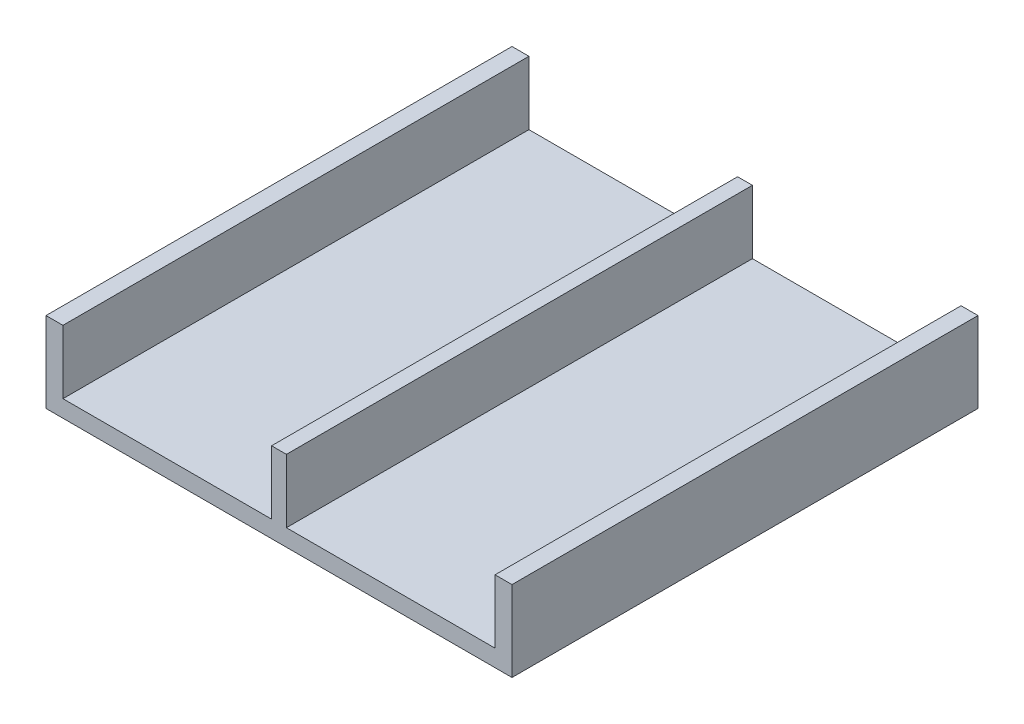
ISO-10303-21;
HEADER;
FILE_DESCRIPTION(('STEP AP214'),'2;1');
FILE_NAME('part.step','',(''),(''),'','','');
FILE_SCHEMA(('AUTOMOTIVE_DESIGN { 1 0 10303 214 1 1 1 1 }'));
ENDSEC;
DATA;
#1=APPLICATION_CONTEXT('core data for automotive mechanical design processes');
#2=APPLICATION_PROTOCOL_DEFINITION('international standard','automotive_design',2000,#1);
#3=PRODUCT_CONTEXT('',#1,'mechanical');
#4=PRODUCT('Part','Part','',(#3));
#5=PRODUCT_RELATED_PRODUCT_CATEGORY('part','',(#4));
#6=PRODUCT_DEFINITION_FORMATION('','',#4);
#7=PRODUCT_DEFINITION_CONTEXT('part definition',#1,'design');
#8=PRODUCT_DEFINITION('design','',#6,#7);
#9=PRODUCT_DEFINITION_SHAPE('','',#8);
#10=(LENGTH_UNIT() NAMED_UNIT(*) SI_UNIT(.MILLI.,.METRE.));
#11=(NAMED_UNIT(*) PLANE_ANGLE_UNIT() SI_UNIT($,.RADIAN.));
#12=(NAMED_UNIT(*) SI_UNIT($,.STERADIAN.) SOLID_ANGLE_UNIT());
#13=UNCERTAINTY_MEASURE_WITH_UNIT(LENGTH_MEASURE(1.E-05),#10,'distance_accuracy_value','');
#14=(GEOMETRIC_REPRESENTATION_CONTEXT(3) GLOBAL_UNCERTAINTY_ASSIGNED_CONTEXT((#13)) GLOBAL_UNIT_ASSIGNED_CONTEXT((#10,
#11,#12)) REPRESENTATION_CONTEXT('',''));
#15=CARTESIAN_POINT('',(0.,0.,0.));
#16=DIRECTION('',(0.,0.,1.));
#17=DIRECTION('',(1.,0.,0.));
#18=AXIS2_PLACEMENT_3D('',#15,#16,#17);
#19=CARTESIAN_POINT('',(0.,19.,0.));
#20=DIRECTION('',(0.,1.,0.));
#21=DIRECTION('',(0.,0.,1.));
#22=AXIS2_PLACEMENT_3D('',#19,#20,#21);
#23=PLANE('',#22);
#24=DIRECTION('',(0.,0.,-1.));
#25=VECTOR('',#24,1.);
#26=CARTESIAN_POINT('',(-1.75,19.,-55.));
#27=LINE('',#26,#25);
#28=CARTESIAN_POINT('',(-1.74999999999999,19.,55.));
#29=VERTEX_POINT('',#28);
#30=CARTESIAN_POINT('',(-1.75,19.,-55.));
#31=VERTEX_POINT('',#30);
#32=EDGE_CURVE('E127',#29,#31,#27,.T.);
#33=ORIENTED_EDGE('',*,*,#32,.F.);
#34=DIRECTION('',(1.,0.,0.));
#35=VECTOR('',#34,1.);
#36=CARTESIAN_POINT('',(-55.,19.,55.));
#37=LINE('',#36,#35);
#38=CARTESIAN_POINT('',(1.75000000000001,19.,55.));
#39=VERTEX_POINT('',#38);
#40=EDGE_CURVE('E200',#29,#39,#37,.T.);
#41=ORIENTED_EDGE('',*,*,#40,.T.);
#42=DIRECTION('',(0.,0.,1.));
#43=VECTOR('',#42,1.);
#44=CARTESIAN_POINT('',(1.75,19.,-55.));
#45=LINE('',#44,#43);
#46=CARTESIAN_POINT('',(1.75,19.,-55.));
#47=VERTEX_POINT('',#46);
#48=EDGE_CURVE('E174',#47,#39,#45,.T.);
#49=ORIENTED_EDGE('',*,*,#48,.F.);
#50=DIRECTION('',(-1.,0.,0.));
#51=VECTOR('',#50,1.);
#52=CARTESIAN_POINT('',(-55.,19.,-55.));
#53=LINE('',#52,#51);
#54=EDGE_CURVE('E193',#47,#31,#53,.T.);
#55=ORIENTED_EDGE('',*,*,#54,.T.);
#56=EDGE_LOOP('',(#33,#41,#49,#55));
#57=FACE_BOUND('',#56,.T.);
#58=ADVANCED_FACE('F33',(#57),#23,.T.);
#59=DIRECTION('',(0.,0.,1.));
#60=VECTOR('',#59,1.);
#61=CARTESIAN_POINT('',(-51.,19.,-55.));
#62=LINE('',#61,#60);
#63=CARTESIAN_POINT('',(-51.,19.,-55.));
#64=VERTEX_POINT('',#63);
#65=CARTESIAN_POINT('',(-51.,19.,55.));
#66=VERTEX_POINT('',#65);
#67=EDGE_CURVE('E141',#64,#66,#62,.T.);
#68=ORIENTED_EDGE('',*,*,#67,.F.);
#69=CARTESIAN_POINT('',(-55.,19.,-55.));
#70=VERTEX_POINT('',#69);
#71=EDGE_CURVE('E187',#64,#70,#53,.T.);
#72=ORIENTED_EDGE('',*,*,#71,.T.);
#73=DIRECTION('',(0.,0.,1.));
#74=VECTOR('',#73,1.);
#75=CARTESIAN_POINT('',(-55.,19.,-55.));
#76=LINE('',#75,#74);
#77=CARTESIAN_POINT('',(-55.,19.,55.));
#78=VERTEX_POINT('',#77);
#79=EDGE_CURVE('E192',#70,#78,#76,.T.);
#80=ORIENTED_EDGE('',*,*,#79,.T.);
#81=EDGE_CURVE('E196',#78,#66,#37,.T.);
#82=ORIENTED_EDGE('',*,*,#81,.T.);
#83=EDGE_LOOP('',(#68,#72,#80,#82));
#84=FACE_BOUND('',#83,.T.);
#85=ADVANCED_FACE('F245',(#84),#23,.T.);
#86=CARTESIAN_POINT('',(55.,19.,-55.));
#87=DIRECTION('',(-1.,0.,0.));
#88=DIRECTION('',(0.,0.,1.));
#89=AXIS2_PLACEMENT_3D('',#86,#87,#88);
#90=PLANE('',#89);
#91=DIRECTION('',(0.,0.,-1.));
#92=VECTOR('',#91,1.);
#93=CARTESIAN_POINT('',(55.,0.,-55.));
#94=LINE('',#93,#92);
#95=CARTESIAN_POINT('',(55.,0.,55.));
#96=VERTEX_POINT('',#95);
#97=CARTESIAN_POINT('',(55.,0.,-55.));
#98=VERTEX_POINT('',#97);
#99=EDGE_CURVE('E155',#96,#98,#94,.T.);
#100=ORIENTED_EDGE('',*,*,#99,.T.);
#101=DIRECTION('',(0.,-1.,0.));
#102=VECTOR('',#101,1.);
#103=CARTESIAN_POINT('',(55.,19.,-55.));
#104=LINE('',#103,#102);
#105=CARTESIAN_POINT('',(55.,19.,-55.));
#106=VERTEX_POINT('',#105);
#107=EDGE_CURVE('E11',#106,#98,#104,.T.);
#108=ORIENTED_EDGE('',*,*,#107,.F.);
#109=DIRECTION('',(0.,0.,-1.));
#110=VECTOR('',#109,1.);
#111=CARTESIAN_POINT('',(55.,19.,-55.));
#112=LINE('',#111,#110);
#113=CARTESIAN_POINT('',(55.,19.,55.));
#114=VERTEX_POINT('',#113);
#115=EDGE_CURVE('E184',#114,#106,#112,.T.);
#116=ORIENTED_EDGE('',*,*,#115,.F.);
#117=DIRECTION('',(0.,-1.,0.));
#118=VECTOR('',#117,1.);
#119=CARTESIAN_POINT('',(55.,19.,55.));
#120=LINE('',#119,#118);
#121=EDGE_CURVE('E199',#114,#96,#120,.T.);
#122=ORIENTED_EDGE('',*,*,#121,.T.);
#123=EDGE_LOOP('',(#100,#108,#116,#122));
#124=FACE_BOUND('',#123,.T.);
#125=ADVANCED_FACE('F35',(#124),#90,.F.);
#126=CARTESIAN_POINT('',(-55.,19.,-55.));
#127=DIRECTION('',(0.,0.,1.));
#128=DIRECTION('',(1.,0.,0.));
#129=AXIS2_PLACEMENT_3D('',#126,#127,#128);
#130=PLANE('',#129);
#131=DIRECTION('',(-1.,0.,0.));
#132=VECTOR('',#131,1.);
#133=CARTESIAN_POINT('',(-51.,4.,-55.));
#134=LINE('',#133,#132);
#135=CARTESIAN_POINT('',(-1.75,4.,-55.));
#136=VERTEX_POINT('',#135);
#137=CARTESIAN_POINT('',(-51.,4.,-55.));
#138=VERTEX_POINT('',#137);
#139=EDGE_CURVE('E138',#136,#138,#134,.T.);
#140=ORIENTED_EDGE('',*,*,#139,.F.);
#141=DIRECTION('',(0.,1.,0.));
#142=VECTOR('',#141,1.);
#143=CARTESIAN_POINT('',(-1.75,4.,-55.));
#144=LINE('',#143,#142);
#145=EDGE_CURVE('E121',#136,#31,#144,.T.);
#146=ORIENTED_EDGE('',*,*,#145,.T.);
#147=ORIENTED_EDGE('',*,*,#54,.F.);
#148=DIRECTION('',(0.,1.,0.));
#149=VECTOR('',#148,1.);
#150=CARTESIAN_POINT('',(1.75,4.,-55.));
#151=LINE('',#150,#149);
#152=CARTESIAN_POINT('',(1.75,4.,-55.));
#153=VERTEX_POINT('',#152);
#154=EDGE_CURVE('E151',#153,#47,#151,.T.);
#155=ORIENTED_EDGE('',*,*,#154,.F.);
#156=DIRECTION('',(-1.,0.,0.));
#157=VECTOR('',#156,1.);
#158=CARTESIAN_POINT('',(1.75,4.,-55.));
#159=LINE('',#158,#157);
#160=CARTESIAN_POINT('',(51.,4.,-55.));
#161=VERTEX_POINT('',#160);
#162=EDGE_CURVE('E170',#161,#153,#159,.T.);
#163=ORIENTED_EDGE('',*,*,#162,.F.);
#164=DIRECTION('',(0.,1.,0.));
#165=VECTOR('',#164,1.);
#166=CARTESIAN_POINT('',(51.,4.,-55.));
#167=LINE('',#166,#165);
#168=CARTESIAN_POINT('',(51.,19.,-55.));
#169=VERTEX_POINT('',#168);
#170=EDGE_CURVE('E178',#161,#169,#167,.T.);
#171=ORIENTED_EDGE('',*,*,#170,.T.);
#172=EDGE_CURVE('E189',#106,#169,#53,.T.);
#173=ORIENTED_EDGE('',*,*,#172,.F.);
#174=ORIENTED_EDGE('',*,*,#107,.T.);
#175=DIRECTION('',(-1.,0.,0.));
#176=VECTOR('',#175,1.);
#177=CARTESIAN_POINT('',(-55.,0.,-55.));
#178=LINE('',#177,#176);
#179=CARTESIAN_POINT('',(-55.,0.,-55.));
#180=VERTEX_POINT('',#179);
#181=EDGE_CURVE('E203',#98,#180,#178,.T.);
#182=ORIENTED_EDGE('',*,*,#181,.T.);
#183=DIRECTION('',(0.,-1.,0.));
#184=VECTOR('',#183,1.);
#185=CARTESIAN_POINT('',(-55.,19.,-55.));
#186=LINE('',#185,#184);
#187=EDGE_CURVE('E41',#70,#180,#186,.T.);
#188=ORIENTED_EDGE('',*,*,#187,.F.);
#189=ORIENTED_EDGE('',*,*,#71,.F.);
#190=DIRECTION('',(0.,1.,0.));
#191=VECTOR('',#190,1.);
#192=CARTESIAN_POINT('',(-51.,4.,-55.));
#193=LINE('',#192,#191);
#194=EDGE_CURVE('E56',#138,#64,#193,.T.);
#195=ORIENTED_EDGE('',*,*,#194,.F.);
#196=EDGE_LOOP('',(#140,#146,#147,#155,#163,#171,#173,#174,#182,#188,#189,#195));
#197=FACE_BOUND('',#196,.T.);
#198=ADVANCED_FACE('F143',(#197),#130,.F.);
#199=CARTESIAN_POINT('',(-55.,19.,-55.));
#200=DIRECTION('',(1.,0.,0.));
#201=DIRECTION('',(0.,0.,-1.));
#202=AXIS2_PLACEMENT_3D('',#199,#200,#201);
#203=PLANE('',#202);
#204=DIRECTION('',(0.,0.,1.));
#205=VECTOR('',#204,1.);
#206=CARTESIAN_POINT('',(-55.,0.,-55.));
#207=LINE('',#206,#205);
#208=CARTESIAN_POINT('',(-55.,0.,55.));
#209=VERTEX_POINT('',#208);
#210=EDGE_CURVE('E205',#180,#209,#207,.T.);
#211=ORIENTED_EDGE('',*,*,#210,.T.);
#212=DIRECTION('',(0.,-1.,0.));
#213=VECTOR('',#212,1.);
#214=CARTESIAN_POINT('',(-55.,19.,55.));
#215=LINE('',#214,#213);
#216=EDGE_CURVE('E210',#78,#209,#215,.T.);
#217=ORIENTED_EDGE('',*,*,#216,.F.);
#218=ORIENTED_EDGE('',*,*,#79,.F.);
#219=ORIENTED_EDGE('',*,*,#187,.T.);
#220=EDGE_LOOP('',(#211,#217,#218,#219));
#221=FACE_BOUND('',#220,.T.);
#222=ADVANCED_FACE('F217',(#221),#203,.F.);
#223=CARTESIAN_POINT('',(-55.,19.,55.));
#224=DIRECTION('',(0.,0.,-1.));
#225=DIRECTION('',(-1.,0.,0.));
#226=AXIS2_PLACEMENT_3D('',#223,#224,#225);
#227=PLANE('',#226);
#228=ORIENTED_EDGE('',*,*,#40,.F.);
#229=DIRECTION('',(0.,1.,0.));
#230=VECTOR('',#229,1.);
#231=CARTESIAN_POINT('',(-1.74999999999999,4.,55.));
#232=LINE('',#231,#230);
#233=CARTESIAN_POINT('',(-1.74999999999999,4.,55.));
#234=VERTEX_POINT('',#233);
#235=EDGE_CURVE('E153',#234,#29,#232,.T.);
#236=ORIENTED_EDGE('',*,*,#235,.F.);
#237=DIRECTION('',(1.,0.,0.));
#238=VECTOR('',#237,1.);
#239=CARTESIAN_POINT('',(-51.,4.,55.));
#240=LINE('',#239,#238);
#241=CARTESIAN_POINT('',(-51.,4.,55.));
#242=VERTEX_POINT('',#241);
#243=EDGE_CURVE('E132',#242,#234,#240,.T.);
#244=ORIENTED_EDGE('',*,*,#243,.F.);
#245=DIRECTION('',(0.,1.,0.));
#246=VECTOR('',#245,1.);
#247=CARTESIAN_POINT('',(-51.,4.,55.));
#248=LINE('',#247,#246);
#249=EDGE_CURVE('E156',#242,#66,#248,.T.);
#250=ORIENTED_EDGE('',*,*,#249,.T.);
#251=ORIENTED_EDGE('',*,*,#81,.F.);
#252=ORIENTED_EDGE('',*,*,#216,.T.);
#253=DIRECTION('',(1.,0.,0.));
#254=VECTOR('',#253,1.);
#255=CARTESIAN_POINT('',(-55.,0.,55.));
#256=LINE('',#255,#254);
#257=EDGE_CURVE('E188',#209,#96,#256,.T.);
#258=ORIENTED_EDGE('',*,*,#257,.T.);
#259=ORIENTED_EDGE('',*,*,#121,.F.);
#260=CARTESIAN_POINT('',(51.,19.,55.));
#261=VERTEX_POINT('',#260);
#262=EDGE_CURVE('E195',#261,#114,#37,.T.);
#263=ORIENTED_EDGE('',*,*,#262,.F.);
#264=DIRECTION('',(0.,1.,0.));
#265=VECTOR('',#264,1.);
#266=CARTESIAN_POINT('',(51.,4.,55.));
#267=LINE('',#266,#265);
#268=CARTESIAN_POINT('',(51.,4.,55.));
#269=VERTEX_POINT('',#268);
#270=EDGE_CURVE('E48',#269,#261,#267,.T.);
#271=ORIENTED_EDGE('',*,*,#270,.F.);
#272=DIRECTION('',(1.,0.,0.));
#273=VECTOR('',#272,1.);
#274=CARTESIAN_POINT('',(1.75000000000001,4.,55.));
#275=LINE('',#274,#273);
#276=CARTESIAN_POINT('',(1.75000000000001,4.,55.));
#277=VERTEX_POINT('',#276);
#278=EDGE_CURVE('E163',#277,#269,#275,.T.);
#279=ORIENTED_EDGE('',*,*,#278,.F.);
#280=DIRECTION('',(0.,1.,0.));
#281=VECTOR('',#280,1.);
#282=CARTESIAN_POINT('',(1.75000000000001,4.,55.));
#283=LINE('',#282,#281);
#284=EDGE_CURVE('E173',#277,#39,#283,.T.);
#285=ORIENTED_EDGE('',*,*,#284,.T.);
#286=EDGE_LOOP('',(#228,#236,#244,#250,#251,#252,#258,#259,#263,#271,#279,#285));
#287=FACE_BOUND('',#286,.T.);
#288=ADVANCED_FACE('F226',(#287),#227,.F.);
#289=DIRECTION('',(0.,0.,-1.));
#290=VECTOR('',#289,1.);
#291=CARTESIAN_POINT('',(51.,19.,-55.));
#292=LINE('',#291,#290);
#293=EDGE_CURVE('E164',#261,#169,#292,.T.);
#294=ORIENTED_EDGE('',*,*,#293,.F.);
#295=ORIENTED_EDGE('',*,*,#262,.T.);
#296=ORIENTED_EDGE('',*,*,#115,.T.);
#297=ORIENTED_EDGE('',*,*,#172,.T.);
#298=EDGE_LOOP('',(#294,#295,#296,#297));
#299=FACE_BOUND('',#298,.T.);
#300=ADVANCED_FACE('F233',(#299),#23,.T.);
#301=CARTESIAN_POINT('',(0.,0.,0.));
#302=DIRECTION('',(0.,1.,0.));
#303=DIRECTION('',(0.,0.,1.));
#304=AXIS2_PLACEMENT_3D('',#301,#302,#303);
#305=PLANE('',#304);
#306=ORIENTED_EDGE('',*,*,#99,.F.);
#307=ORIENTED_EDGE('',*,*,#257,.F.);
#308=ORIENTED_EDGE('',*,*,#210,.F.);
#309=ORIENTED_EDGE('',*,*,#181,.F.);
#310=EDGE_LOOP('',(#306,#307,#308,#309));
#311=FACE_BOUND('',#310,.T.);
#312=ADVANCED_FACE('F222',(#311),#305,.F.);
#313=CARTESIAN_POINT('',(1.75,4.,-55.));
#314=DIRECTION('',(-1.,0.,0.));
#315=DIRECTION('',(0.,0.,1.));
#316=AXIS2_PLACEMENT_3D('',#313,#314,#315);
#317=PLANE('',#316);
#318=ORIENTED_EDGE('',*,*,#48,.T.);
#319=ORIENTED_EDGE('',*,*,#284,.F.);
#320=DIRECTION('',(0.,0.,1.));
#321=VECTOR('',#320,1.);
#322=CARTESIAN_POINT('',(1.75,4.,-55.));
#323=LINE('',#322,#321);
#324=EDGE_CURVE('E160',#153,#277,#323,.T.);
#325=ORIENTED_EDGE('',*,*,#324,.F.);
#326=ORIENTED_EDGE('',*,*,#154,.T.);
#327=EDGE_LOOP('',(#318,#319,#325,#326));
#328=FACE_BOUND('',#327,.T.);
#329=ADVANCED_FACE('F239',(#328),#317,.F.);
#330=CARTESIAN_POINT('',(51.,4.,-55.));
#331=DIRECTION('',(1.,0.,0.));
#332=DIRECTION('',(0.,0.,-1.));
#333=AXIS2_PLACEMENT_3D('',#330,#331,#332);
#334=PLANE('',#333);
#335=ORIENTED_EDGE('',*,*,#293,.T.);
#336=ORIENTED_EDGE('',*,*,#170,.F.);
#337=DIRECTION('',(0.,0.,-1.));
#338=VECTOR('',#337,1.);
#339=CARTESIAN_POINT('',(51.,4.,-55.));
#340=LINE('',#339,#338);
#341=EDGE_CURVE('E167',#269,#161,#340,.T.);
#342=ORIENTED_EDGE('',*,*,#341,.F.);
#343=ORIENTED_EDGE('',*,*,#270,.T.);
#344=EDGE_LOOP('',(#335,#336,#342,#343));
#345=FACE_BOUND('',#344,.T.);
#346=ADVANCED_FACE('F309',(#345),#334,.F.);
#347=CARTESIAN_POINT('',(0.,4.,0.));
#348=DIRECTION('',(0.,1.,0.));
#349=DIRECTION('',(0.,0.,1.));
#350=AXIS2_PLACEMENT_3D('',#347,#348,#349);
#351=PLANE('',#350);
#352=ORIENTED_EDGE('',*,*,#324,.T.);
#353=ORIENTED_EDGE('',*,*,#278,.T.);
#354=ORIENTED_EDGE('',*,*,#341,.T.);
#355=ORIENTED_EDGE('',*,*,#162,.T.);
#356=EDGE_LOOP('',(#352,#353,#354,#355));
#357=FACE_BOUND('',#356,.T.);
#358=ADVANCED_FACE('F241',(#357),#351,.T.);
#359=CARTESIAN_POINT('',(-1.75,4.,-55.));
#360=DIRECTION('',(1.,0.,0.));
#361=DIRECTION('',(0.,0.,-1.));
#362=AXIS2_PLACEMENT_3D('',#359,#360,#361);
#363=PLANE('',#362);
#364=ORIENTED_EDGE('',*,*,#32,.T.);
#365=ORIENTED_EDGE('',*,*,#145,.F.);
#366=DIRECTION('',(0.,0.,-1.));
#367=VECTOR('',#366,1.);
#368=CARTESIAN_POINT('',(-1.75,4.,-55.));
#369=LINE('',#368,#367);
#370=EDGE_CURVE('E124',#234,#136,#369,.T.);
#371=ORIENTED_EDGE('',*,*,#370,.F.);
#372=ORIENTED_EDGE('',*,*,#235,.T.);
#373=EDGE_LOOP('',(#364,#365,#371,#372));
#374=FACE_BOUND('',#373,.T.);
#375=ADVANCED_FACE('F123',(#374),#363,.F.);
#376=CARTESIAN_POINT('',(-51.,4.,-55.));
#377=DIRECTION('',(-1.,0.,0.));
#378=DIRECTION('',(0.,0.,1.));
#379=AXIS2_PLACEMENT_3D('',#376,#377,#378);
#380=PLANE('',#379);
#381=ORIENTED_EDGE('',*,*,#67,.T.);
#382=ORIENTED_EDGE('',*,*,#249,.F.);
#383=DIRECTION('',(0.,0.,1.));
#384=VECTOR('',#383,1.);
#385=CARTESIAN_POINT('',(-51.,4.,-55.));
#386=LINE('',#385,#384);
#387=EDGE_CURVE('E145',#138,#242,#386,.T.);
#388=ORIENTED_EDGE('',*,*,#387,.F.);
#389=ORIENTED_EDGE('',*,*,#194,.T.);
#390=EDGE_LOOP('',(#381,#382,#388,#389));
#391=FACE_BOUND('',#390,.T.);
#392=ADVANCED_FACE('F246',(#391),#380,.F.);
#393=CARTESIAN_POINT('',(0.,4.,0.));
#394=DIRECTION('',(0.,1.,0.));
#395=DIRECTION('',(0.,0.,1.));
#396=AXIS2_PLACEMENT_3D('',#393,#394,#395);
#397=PLANE('',#396);
#398=ORIENTED_EDGE('',*,*,#370,.T.);
#399=ORIENTED_EDGE('',*,*,#139,.T.);
#400=ORIENTED_EDGE('',*,*,#387,.T.);
#401=ORIENTED_EDGE('',*,*,#243,.T.);
#402=EDGE_LOOP('',(#398,#399,#400,#401));
#403=FACE_BOUND('',#402,.T.);
#404=ADVANCED_FACE('F136',(#403),#397,.T.);
#405=CLOSED_SHELL('',(#58,#85,#125,#198,#222,#288,#300,#312,#329,#346,#358,#375,#392,#404));
#406=MANIFOLD_SOLID_BREP('B2',#405);
#407=ADVANCED_BREP_SHAPE_REPRESENTATION('',(#18,#406),#14);
#408=SHAPE_DEFINITION_REPRESENTATION(#9,#407);
ENDSEC;
END-ISO-10303-21;
